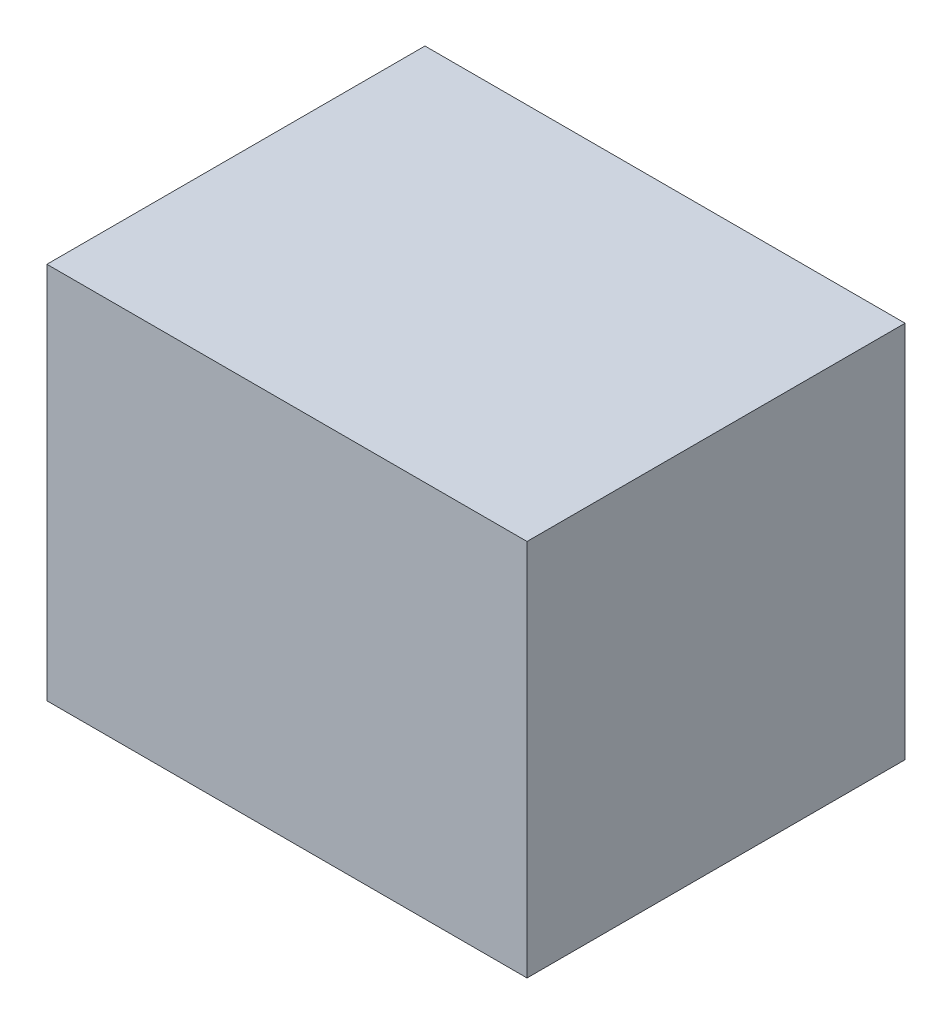
ISO-10303-21;
HEADER;
FILE_DESCRIPTION(('STEP AP214'),'2;1');
FILE_NAME('part.step','',(''),(''),'','','');
FILE_SCHEMA(('AUTOMOTIVE_DESIGN { 1 0 10303 214 1 1 1 1 }'));
ENDSEC;
DATA;
#1=APPLICATION_CONTEXT('core data for automotive mechanical design processes');
#2=APPLICATION_PROTOCOL_DEFINITION('international standard','automotive_design',2000,#1);
#3=PRODUCT_CONTEXT('',#1,'mechanical');
#4=PRODUCT('Part','Part','',(#3));
#5=PRODUCT_RELATED_PRODUCT_CATEGORY('part','',(#4));
#6=PRODUCT_DEFINITION_FORMATION('','',#4);
#7=PRODUCT_DEFINITION_CONTEXT('part definition',#1,'design');
#8=PRODUCT_DEFINITION('design','',#6,#7);
#9=PRODUCT_DEFINITION_SHAPE('','',#8);
#10=(LENGTH_UNIT() NAMED_UNIT(*) SI_UNIT(.MILLI.,.METRE.));
#11=(NAMED_UNIT(*) PLANE_ANGLE_UNIT() SI_UNIT($,.RADIAN.));
#12=(NAMED_UNIT(*) SI_UNIT($,.STERADIAN.) SOLID_ANGLE_UNIT());
#13=UNCERTAINTY_MEASURE_WITH_UNIT(LENGTH_MEASURE(1.E-05),#10,'distance_accuracy_value','');
#14=(GEOMETRIC_REPRESENTATION_CONTEXT(3) GLOBAL_UNCERTAINTY_ASSIGNED_CONTEXT((#13)) GLOBAL_UNIT_ASSIGNED_CONTEXT((#10,
#11,#12)) REPRESENTATION_CONTEXT('',''));
#15=CARTESIAN_POINT('',(0.,0.,0.));
#16=DIRECTION('',(0.,0.,1.));
#17=DIRECTION('',(1.,0.,0.));
#18=AXIS2_PLACEMENT_3D('',#15,#16,#17);
#19=CARTESIAN_POINT('',(12.7,10.,9.99999999999999));
#20=DIRECTION('',(0.,0.,-1.));
#21=DIRECTION('',(0.,1.,0.));
#22=AXIS2_PLACEMENT_3D('',#19,#20,#21);
#23=PLANE('',#22);
#24=DIRECTION('',(0.,-1.,0.));
#25=VECTOR('',#24,1.);
#26=CARTESIAN_POINT('',(-12.7,10.,9.99999999999999));
#27=LINE('',#26,#25);
#28=CARTESIAN_POINT('',(-12.7,10.,9.99999999999999));
#29=VERTEX_POINT('',#28);
#30=CARTESIAN_POINT('',(-12.7,-10.,9.99999999999999));
#31=VERTEX_POINT('',#30);
#32=EDGE_CURVE('E97',#29,#31,#27,.T.);
#33=ORIENTED_EDGE('',*,*,#32,.T.);
#34=DIRECTION('',(-1.,0.,0.));
#35=VECTOR('',#34,1.);
#36=CARTESIAN_POINT('',(12.7,-10.,9.99999999999999));
#37=LINE('',#36,#35);
#38=CARTESIAN_POINT('',(12.7,-10.,9.99999999999999));
#39=VERTEX_POINT('',#38);
#40=EDGE_CURVE('E11',#39,#31,#37,.T.);
#41=ORIENTED_EDGE('',*,*,#40,.F.);
#42=DIRECTION('',(0.,-1.,0.));
#43=VECTOR('',#42,1.);
#44=CARTESIAN_POINT('',(12.7,10.,9.99999999999999));
#45=LINE('',#44,#43);
#46=CARTESIAN_POINT('',(12.7,10.,9.99999999999999));
#47=VERTEX_POINT('',#46);
#48=EDGE_CURVE('E85',#47,#39,#45,.T.);
#49=ORIENTED_EDGE('',*,*,#48,.F.);
#50=DIRECTION('',(-1.,0.,0.));
#51=VECTOR('',#50,1.);
#52=CARTESIAN_POINT('',(12.7,10.,9.99999999999999));
#53=LINE('',#52,#51);
#54=EDGE_CURVE('E93',#47,#29,#53,.T.);
#55=ORIENTED_EDGE('',*,*,#54,.T.);
#56=EDGE_LOOP('',(#33,#41,#49,#55));
#57=FACE_BOUND('',#56,.T.);
#58=ADVANCED_FACE('F34',(#57),#23,.F.);
#59=CARTESIAN_POINT('',(12.7,-9.99999999999999,-10.));
#60=DIRECTION('',(0.,1.,0.));
#61=DIRECTION('',(0.,0.,1.));
#62=AXIS2_PLACEMENT_3D('',#59,#60,#61);
#63=PLANE('',#62);
#64=DIRECTION('',(0.,0.,-1.));
#65=VECTOR('',#64,1.);
#66=CARTESIAN_POINT('',(-12.7,-9.99999999999999,-10.));
#67=LINE('',#66,#65);
#68=CARTESIAN_POINT('',(-12.7,-9.99999999999999,-10.));
#69=VERTEX_POINT('',#68);
#70=EDGE_CURVE('E89',#31,#69,#67,.T.);
#71=ORIENTED_EDGE('',*,*,#70,.T.);
#72=DIRECTION('',(-1.,0.,0.));
#73=VECTOR('',#72,1.);
#74=CARTESIAN_POINT('',(12.7,-9.99999999999999,-10.));
#75=LINE('',#74,#73);
#76=CARTESIAN_POINT('',(12.7,-9.99999999999999,-10.));
#77=VERTEX_POINT('',#76);
#78=EDGE_CURVE('E42',#77,#69,#75,.T.);
#79=ORIENTED_EDGE('',*,*,#78,.F.);
#80=DIRECTION('',(0.,0.,-1.));
#81=VECTOR('',#80,1.);
#82=CARTESIAN_POINT('',(12.7,-9.99999999999999,-10.));
#83=LINE('',#82,#81);
#84=EDGE_CURVE('E80',#39,#77,#83,.T.);
#85=ORIENTED_EDGE('',*,*,#84,.F.);
#86=ORIENTED_EDGE('',*,*,#40,.T.);
#87=EDGE_LOOP('',(#71,#79,#85,#86));
#88=FACE_BOUND('',#87,.T.);
#89=ADVANCED_FACE('F88',(#88),#63,.F.);
#90=CARTESIAN_POINT('',(12.7,10.,-10.));
#91=DIRECTION('',(0.,0.,1.));
#92=DIRECTION('',(0.,-1.,0.));
#93=AXIS2_PLACEMENT_3D('',#90,#91,#92);
#94=PLANE('',#93);
#95=DIRECTION('',(0.,1.,0.));
#96=VECTOR('',#95,1.);
#97=CARTESIAN_POINT('',(-12.7,10.,-10.));
#98=LINE('',#97,#96);
#99=CARTESIAN_POINT('',(-12.7,10.,-10.));
#100=VERTEX_POINT('',#99);
#101=EDGE_CURVE('E67',#69,#100,#98,.T.);
#102=ORIENTED_EDGE('',*,*,#101,.T.);
#103=DIRECTION('',(-1.,0.,0.));
#104=VECTOR('',#103,1.);
#105=CARTESIAN_POINT('',(12.7,10.,-10.));
#106=LINE('',#105,#104);
#107=CARTESIAN_POINT('',(12.7,10.,-10.));
#108=VERTEX_POINT('',#107);
#109=EDGE_CURVE('E90',#108,#100,#106,.T.);
#110=ORIENTED_EDGE('',*,*,#109,.F.);
#111=DIRECTION('',(0.,1.,0.));
#112=VECTOR('',#111,1.);
#113=CARTESIAN_POINT('',(12.7,10.,-10.));
#114=LINE('',#113,#112);
#115=EDGE_CURVE('E83',#77,#108,#114,.T.);
#116=ORIENTED_EDGE('',*,*,#115,.F.);
#117=ORIENTED_EDGE('',*,*,#78,.T.);
#118=EDGE_LOOP('',(#102,#110,#116,#117));
#119=FACE_BOUND('',#118,.T.);
#120=ADVANCED_FACE('F91',(#119),#94,.F.);
#121=CARTESIAN_POINT('',(12.7,10.,-10.));
#122=DIRECTION('',(0.,-1.,0.));
#123=DIRECTION('',(0.,0.,-1.));
#124=AXIS2_PLACEMENT_3D('',#121,#122,#123);
#125=PLANE('',#124);
#126=DIRECTION('',(0.,0.,1.));
#127=VECTOR('',#126,1.);
#128=CARTESIAN_POINT('',(-12.7,10.,-10.));
#129=LINE('',#128,#127);
#130=EDGE_CURVE('E73',#100,#29,#129,.T.);
#131=ORIENTED_EDGE('',*,*,#130,.T.);
#132=ORIENTED_EDGE('',*,*,#54,.F.);
#133=DIRECTION('',(0.,0.,1.));
#134=VECTOR('',#133,1.);
#135=CARTESIAN_POINT('',(12.7,10.,-10.));
#136=LINE('',#135,#134);
#137=EDGE_CURVE('E50',#108,#47,#136,.T.);
#138=ORIENTED_EDGE('',*,*,#137,.F.);
#139=ORIENTED_EDGE('',*,*,#109,.T.);
#140=EDGE_LOOP('',(#131,#132,#138,#139));
#141=FACE_BOUND('',#140,.T.);
#142=ADVANCED_FACE('F104',(#141),#125,.F.);
#143=CARTESIAN_POINT('',(12.7,0.,0.));
#144=DIRECTION('',(-1.,0.,0.));
#145=DIRECTION('',(0.,0.,1.));
#146=AXIS2_PLACEMENT_3D('',#143,#144,#145);
#147=PLANE('',#146);
#148=ORIENTED_EDGE('',*,*,#48,.T.);
#149=ORIENTED_EDGE('',*,*,#84,.T.);
#150=ORIENTED_EDGE('',*,*,#115,.T.);
#151=ORIENTED_EDGE('',*,*,#137,.T.);
#152=EDGE_LOOP('',(#148,#149,#150,#151));
#153=FACE_BOUND('',#152,.T.);
#154=ADVANCED_FACE('F81',(#153),#147,.F.);
#155=CARTESIAN_POINT('',(-12.7,0.,0.));
#156=DIRECTION('',(-1.,0.,0.));
#157=DIRECTION('',(0.,0.,1.));
#158=AXIS2_PLACEMENT_3D('',#155,#156,#157);
#159=PLANE('',#158);
#160=ORIENTED_EDGE('',*,*,#32,.F.);
#161=ORIENTED_EDGE('',*,*,#130,.F.);
#162=ORIENTED_EDGE('',*,*,#101,.F.);
#163=ORIENTED_EDGE('',*,*,#70,.F.);
#164=EDGE_LOOP('',(#160,#161,#162,#163));
#165=FACE_BOUND('',#164,.T.);
#166=ADVANCED_FACE('F107',(#165),#159,.T.);
#167=CLOSED_SHELL('',(#58,#89,#120,#142,#154,#166));
#168=MANIFOLD_SOLID_BREP('B2',#167);
#169=ADVANCED_BREP_SHAPE_REPRESENTATION('',(#18,#168),#14);
#170=SHAPE_DEFINITION_REPRESENTATION(#9,#169);
ENDSEC;
END-ISO-10303-21;
